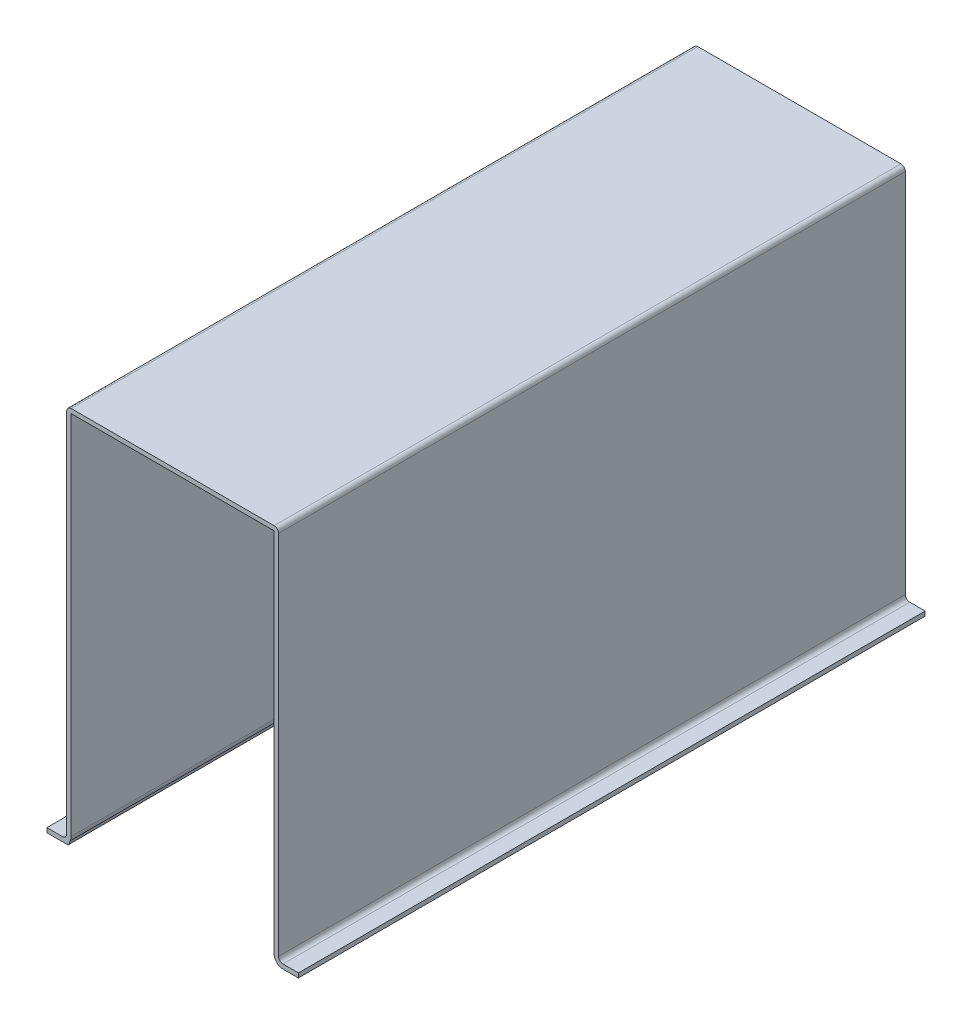
ISO-10303-21;
HEADER;
FILE_DESCRIPTION(('STEP AP214'),'2;1');
FILE_NAME('part.step','',(''),(''),'','','');
FILE_SCHEMA(('AUTOMOTIVE_DESIGN { 1 0 10303 214 1 1 1 1 }'));
ENDSEC;
DATA;
#1=APPLICATION_CONTEXT('core data for automotive mechanical design processes');
#2=APPLICATION_PROTOCOL_DEFINITION('international standard','automotive_design',2000,#1);
#3=PRODUCT_CONTEXT('',#1,'mechanical');
#4=PRODUCT('Part','Part','',(#3));
#5=PRODUCT_RELATED_PRODUCT_CATEGORY('part','',(#4));
#6=PRODUCT_DEFINITION_FORMATION('','',#4);
#7=PRODUCT_DEFINITION_CONTEXT('part definition',#1,'design');
#8=PRODUCT_DEFINITION('design','',#6,#7);
#9=PRODUCT_DEFINITION_SHAPE('','',#8);
#10=(LENGTH_UNIT() NAMED_UNIT(*) SI_UNIT(.MILLI.,.METRE.));
#11=(NAMED_UNIT(*) PLANE_ANGLE_UNIT() SI_UNIT($,.RADIAN.));
#12=(NAMED_UNIT(*) SI_UNIT($,.STERADIAN.) SOLID_ANGLE_UNIT());
#13=UNCERTAINTY_MEASURE_WITH_UNIT(LENGTH_MEASURE(1.E-05),#10,'distance_accuracy_value','');
#14=(GEOMETRIC_REPRESENTATION_CONTEXT(3) GLOBAL_UNCERTAINTY_ASSIGNED_CONTEXT((#13)) GLOBAL_UNIT_ASSIGNED_CONTEXT((#10,
#11,#12)) REPRESENTATION_CONTEXT('',''));
#15=CARTESIAN_POINT('',(0.,0.,0.));
#16=DIRECTION('',(0.,0.,1.));
#17=DIRECTION('',(1.,0.,0.));
#18=AXIS2_PLACEMENT_3D('',#15,#16,#17);
#19=CARTESIAN_POINT('',(-52.,-1.,284.));
#20=DIRECTION('',(0.,1.,0.));
#21=DIRECTION('',(0.,0.,1.));
#22=AXIS2_PLACEMENT_3D('',#19,#20,#21);
#23=PLANE('',#22);
#24=DIRECTION('',(1.,0.,0.));
#25=VECTOR('',#24,1.);
#26=CARTESIAN_POINT('',(-52.,-1.,284.));
#27=LINE('',#26,#25);
#28=CARTESIAN_POINT('',(49.5151548792866,-0.999999999999999,284.));
#29=VERTEX_POINT('',#28);
#30=CARTESIAN_POINT('',(57.,-1.,284.));
#31=VERTEX_POINT('',#30);
#32=EDGE_CURVE('E137',#29,#31,#27,.T.);
#33=ORIENTED_EDGE('',*,*,#32,.F.);
#34=DIRECTION('',(0.,0.,-1.));
#35=VECTOR('',#34,1.);
#36=CARTESIAN_POINT('',(49.5151548792866,-1.,284.));
#37=LINE('',#36,#35);
#38=CARTESIAN_POINT('',(49.5151548792866,-0.999999999999999,0.));
#39=VERTEX_POINT('',#38);
#40=EDGE_CURVE('E235',#29,#39,#37,.T.);
#41=ORIENTED_EDGE('',*,*,#40,.T.);
#42=DIRECTION('',(1.,0.,0.));
#43=VECTOR('',#42,1.);
#44=CARTESIAN_POINT('',(-52.,-1.,0.));
#45=LINE('',#44,#43);
#46=CARTESIAN_POINT('',(57.,-1.,0.));
#47=VERTEX_POINT('',#46);
#48=EDGE_CURVE('E159',#39,#47,#45,.T.);
#49=ORIENTED_EDGE('',*,*,#48,.T.);
#50=DIRECTION('',(0.,0.,-1.));
#51=VECTOR('',#50,1.);
#52=CARTESIAN_POINT('',(57.,-1.,284.));
#53=LINE('',#52,#51);
#54=EDGE_CURVE('E286',#31,#47,#53,.T.);
#55=ORIENTED_EDGE('',*,*,#54,.F.);
#56=EDGE_LOOP('',(#33,#41,#49,#55));
#57=FACE_BOUND('',#56,.T.);
#58=ADVANCED_FACE('F33',(#57),#23,.F.);
#59=CARTESIAN_POINT('',(-50.,3.,284.));
#60=DIRECTION('',(0.,0.,1.));
#61=DIRECTION('',(1.,0.,0.));
#62=AXIS2_PLACEMENT_3D('',#59,#60,#61);
#63=PLANE('',#62);
#64=CARTESIAN_POINT('',(50.0181378826154,2.96825000451866,284.));
#65=DIRECTION('',(0.,0.,1.));
#66=DIRECTION('',(-1.,0.,0.));
#67=AXIS2_PLACEMENT_3D('',#64,#65,#66);
#68=CIRCLE('',#67,4.);
#69=CARTESIAN_POINT('',(46.5358983848622,1.,284.));
#70=VERTEX_POINT('',#69);
#71=EDGE_CURVE('E258',#70,#29,#68,.T.);
#72=ORIENTED_EDGE('',*,*,#71,.T.);
#73=ORIENTED_EDGE('',*,*,#32,.T.);
#74=DIRECTION('',(0.,-1.,0.));
#75=VECTOR('',#74,1.);
#76=CARTESIAN_POINT('',(57.,1.,284.));
#77=LINE('',#76,#75);
#78=CARTESIAN_POINT('',(57.,1.,284.));
#79=VERTEX_POINT('',#78);
#80=EDGE_CURVE('E277',#79,#31,#77,.T.);
#81=ORIENTED_EDGE('',*,*,#80,.F.);
#82=DIRECTION('',(-1.,0.,0.));
#83=VECTOR('',#82,1.);
#84=CARTESIAN_POINT('',(50.,1.,284.));
#85=LINE('',#84,#83);
#86=CARTESIAN_POINT('',(50.,0.999999999999999,284.));
#87=VERTEX_POINT('',#86);
#88=EDGE_CURVE('E94',#79,#87,#85,.T.);
#89=ORIENTED_EDGE('',*,*,#88,.T.);
#90=CARTESIAN_POINT('',(50.,3.,284.));
#91=DIRECTION('',(0.,0.,-1.));
#92=DIRECTION('',(-1.,0.,0.));
#93=AXIS2_PLACEMENT_3D('',#90,#91,#92);
#94=CIRCLE('',#93,2.);
#95=CARTESIAN_POINT('',(48.,3.,284.));
#96=VERTEX_POINT('',#95);
#97=EDGE_CURVE('E198',#87,#96,#94,.T.);
#98=ORIENTED_EDGE('',*,*,#97,.T.);
#99=DIRECTION('',(0.,1.,0.));
#100=VECTOR('',#99,1.);
#101=CARTESIAN_POINT('',(48.,3.,284.));
#102=LINE('',#101,#100);
#103=CARTESIAN_POINT('',(48.,169.,284.));
#104=VERTEX_POINT('',#103);
#105=EDGE_CURVE('E178',#96,#104,#102,.T.);
#106=ORIENTED_EDGE('',*,*,#105,.T.);
#107=CARTESIAN_POINT('',(46.,169.,284.));
#108=DIRECTION('',(0.,0.,1.));
#109=DIRECTION('',(1.,0.,0.));
#110=AXIS2_PLACEMENT_3D('',#107,#108,#109);
#111=CIRCLE('',#110,2.);
#112=CARTESIAN_POINT('',(46.,171.,284.));
#113=VERTEX_POINT('',#112);
#114=EDGE_CURVE('E194',#104,#113,#111,.T.);
#115=ORIENTED_EDGE('',*,*,#114,.T.);
#116=DIRECTION('',(-1.,0.,0.));
#117=VECTOR('',#116,1.);
#118=CARTESIAN_POINT('',(-46.,171.,284.));
#119=LINE('',#118,#117);
#120=CARTESIAN_POINT('',(-46.,171.,284.));
#121=VERTEX_POINT('',#120);
#122=EDGE_CURVE('E118',#113,#121,#119,.T.);
#123=ORIENTED_EDGE('',*,*,#122,.T.);
#124=CARTESIAN_POINT('',(-46.,169.,284.));
#125=DIRECTION('',(0.,0.,1.));
#126=DIRECTION('',(-1.,0.,0.));
#127=AXIS2_PLACEMENT_3D('',#124,#125,#126);
#128=CIRCLE('',#127,2.);
#129=CARTESIAN_POINT('',(-48.,169.,284.));
#130=VERTEX_POINT('',#129);
#131=EDGE_CURVE('E111',#121,#130,#128,.T.);
#132=ORIENTED_EDGE('',*,*,#131,.T.);
#133=DIRECTION('',(0.,-1.,0.));
#134=VECTOR('',#133,1.);
#135=CARTESIAN_POINT('',(-48.,3.,284.));
#136=LINE('',#135,#134);
#137=CARTESIAN_POINT('',(-48.,3.,284.));
#138=VERTEX_POINT('',#137);
#139=EDGE_CURVE('E116',#130,#138,#136,.T.);
#140=ORIENTED_EDGE('',*,*,#139,.T.);
#141=CARTESIAN_POINT('',(-50.,3.,284.));
#142=DIRECTION('',(0.,0.,-1.));
#143=DIRECTION('',(1.,0.,0.));
#144=AXIS2_PLACEMENT_3D('',#141,#142,#143);
#145=CIRCLE('',#144,2.);
#146=CARTESIAN_POINT('',(-50.,1.,284.));
#147=VERTEX_POINT('',#146);
#148=EDGE_CURVE('E50',#138,#147,#145,.T.);
#149=ORIENTED_EDGE('',*,*,#148,.T.);
#150=DIRECTION('',(-1.,0.,0.));
#151=VECTOR('',#150,1.);
#152=CARTESIAN_POINT('',(-52.,1.,284.));
#153=LINE('',#152,#151);
#154=CARTESIAN_POINT('',(-57.,1.,284.));
#155=VERTEX_POINT('',#154);
#156=EDGE_CURVE('E132',#147,#155,#153,.T.);
#157=ORIENTED_EDGE('',*,*,#156,.T.);
#158=DIRECTION('',(0.,1.,0.));
#159=VECTOR('',#158,1.);
#160=CARTESIAN_POINT('',(-57.,-1.,284.));
#161=LINE('',#160,#159);
#162=CARTESIAN_POINT('',(-57.,-1.,284.));
#163=VERTEX_POINT('',#162);
#164=EDGE_CURVE('E262',#163,#155,#161,.T.);
#165=ORIENTED_EDGE('',*,*,#164,.F.);
#166=CARTESIAN_POINT('',(-47.4056226822031,-1.,284.));
#167=VERTEX_POINT('',#166);
#168=EDGE_CURVE('E138',#163,#167,#27,.T.);
#169=ORIENTED_EDGE('',*,*,#168,.T.);
#170=CARTESIAN_POINT('',(-50.4999951591916,1.53473055247611,284.));
#171=DIRECTION('',(0.,0.,1.));
#172=DIRECTION('',(-1.,0.,0.));
#173=AXIS2_PLACEMENT_3D('',#170,#171,#172);
#174=CIRCLE('',#173,4.);
#175=CARTESIAN_POINT('',(-46.5358983848623,1.,284.));
#176=VERTEX_POINT('',#175);
#177=EDGE_CURVE('E254',#167,#176,#174,.T.);
#178=ORIENTED_EDGE('',*,*,#177,.T.);
#179=CARTESIAN_POINT('',(-50.,3.,284.));
#180=DIRECTION('',(0.,0.,1.));
#181=DIRECTION('',(-1.,0.,0.));
#182=AXIS2_PLACEMENT_3D('',#179,#180,#181);
#183=CIRCLE('',#182,4.);
#184=CARTESIAN_POINT('',(-46.,3.,284.));
#185=VERTEX_POINT('',#184);
#186=EDGE_CURVE('E244',#176,#185,#183,.T.);
#187=ORIENTED_EDGE('',*,*,#186,.T.);
#188=DIRECTION('',(0.,1.,0.));
#189=VECTOR('',#188,1.);
#190=CARTESIAN_POINT('',(-46.,3.,284.));
#191=LINE('',#190,#189);
#192=CARTESIAN_POINT('',(-46.,169.,284.));
#193=VERTEX_POINT('',#192);
#194=EDGE_CURVE('E241',#185,#193,#191,.T.);
#195=ORIENTED_EDGE('',*,*,#194,.T.);
#196=DIRECTION('',(1.,0.,0.));
#197=VECTOR('',#196,1.);
#198=CARTESIAN_POINT('',(-46.,169.,284.));
#199=LINE('',#198,#197);
#200=CARTESIAN_POINT('',(46.,169.,284.));
#201=VERTEX_POINT('',#200);
#202=EDGE_CURVE('E238',#193,#201,#199,.T.);
#203=ORIENTED_EDGE('',*,*,#202,.T.);
#204=DIRECTION('',(0.,-1.,0.));
#205=VECTOR('',#204,1.);
#206=CARTESIAN_POINT('',(46.,169.,284.));
#207=LINE('',#206,#205);
#208=CARTESIAN_POINT('',(46.,3.,284.));
#209=VERTEX_POINT('',#208);
#210=EDGE_CURVE('E205',#201,#209,#207,.T.);
#211=ORIENTED_EDGE('',*,*,#210,.T.);
#212=CARTESIAN_POINT('',(50.,3.,284.));
#213=DIRECTION('',(0.,0.,1.));
#214=DIRECTION('',(-1.,0.,0.));
#215=AXIS2_PLACEMENT_3D('',#212,#213,#214);
#216=CIRCLE('',#215,4.);
#217=EDGE_CURVE('E222',#209,#70,#216,.T.);
#218=ORIENTED_EDGE('',*,*,#217,.T.);
#219=EDGE_LOOP('',(#72,#73,#81,#89,#98,#106,#115,#123,#132,#140,#149,#157,#165,#169,#178,#187,
#195,#203,#211,#218));
#220=FACE_BOUND('',#219,.T.);
#221=ADVANCED_FACE('F114',(#220),#63,.T.);
#222=CARTESIAN_POINT('',(-50.,3.,0.));
#223=DIRECTION('',(0.,0.,1.));
#224=DIRECTION('',(1.,0.,0.));
#225=AXIS2_PLACEMENT_3D('',#222,#223,#224);
#226=PLANE('',#225);
#227=ORIENTED_EDGE('',*,*,#48,.F.);
#228=CARTESIAN_POINT('',(50.0181378826154,2.96825000451866,0.));
#229=DIRECTION('',(0.,0.,1.));
#230=DIRECTION('',(-1.,0.,0.));
#231=AXIS2_PLACEMENT_3D('',#228,#229,#230);
#232=CIRCLE('',#231,4.);
#233=CARTESIAN_POINT('',(46.5358983848622,1.,0.));
#234=VERTEX_POINT('',#233);
#235=EDGE_CURVE('E259',#234,#39,#232,.T.);
#236=ORIENTED_EDGE('',*,*,#235,.F.);
#237=CARTESIAN_POINT('',(50.,3.,0.));
#238=DIRECTION('',(0.,0.,1.));
#239=DIRECTION('',(-1.,0.,0.));
#240=AXIS2_PLACEMENT_3D('',#237,#238,#239);
#241=CIRCLE('',#240,4.);
#242=CARTESIAN_POINT('',(46.,3.,0.));
#243=VERTEX_POINT('',#242);
#244=EDGE_CURVE('E232',#243,#234,#241,.T.);
#245=ORIENTED_EDGE('',*,*,#244,.F.);
#246=DIRECTION('',(0.,-1.,0.));
#247=VECTOR('',#246,1.);
#248=CARTESIAN_POINT('',(46.,169.,0.));
#249=LINE('',#248,#247);
#250=CARTESIAN_POINT('',(46.,169.,0.));
#251=VERTEX_POINT('',#250);
#252=EDGE_CURVE('E219',#251,#243,#249,.T.);
#253=ORIENTED_EDGE('',*,*,#252,.F.);
#254=DIRECTION('',(1.,0.,0.));
#255=VECTOR('',#254,1.);
#256=CARTESIAN_POINT('',(-46.,169.,0.));
#257=LINE('',#256,#255);
#258=CARTESIAN_POINT('',(-46.,169.,0.));
#259=VERTEX_POINT('',#258);
#260=EDGE_CURVE('E223',#259,#251,#257,.T.);
#261=ORIENTED_EDGE('',*,*,#260,.F.);
#262=DIRECTION('',(0.,1.,0.));
#263=VECTOR('',#262,1.);
#264=CARTESIAN_POINT('',(-46.,3.,0.));
#265=LINE('',#264,#263);
#266=CARTESIAN_POINT('',(-46.,3.,0.));
#267=VERTEX_POINT('',#266);
#268=EDGE_CURVE('E226',#267,#259,#265,.T.);
#269=ORIENTED_EDGE('',*,*,#268,.F.);
#270=CARTESIAN_POINT('',(-50.,3.,0.));
#271=DIRECTION('',(0.,0.,1.));
#272=DIRECTION('',(-1.,0.,0.));
#273=AXIS2_PLACEMENT_3D('',#270,#271,#272);
#274=CIRCLE('',#273,4.);
#275=CARTESIAN_POINT('',(-46.5358983848623,1.,0.));
#276=VERTEX_POINT('',#275);
#277=EDGE_CURVE('E229',#276,#267,#274,.T.);
#278=ORIENTED_EDGE('',*,*,#277,.F.);
#279=CARTESIAN_POINT('',(-50.4999951591916,1.53473055247611,0.));
#280=DIRECTION('',(0.,0.,1.));
#281=DIRECTION('',(-1.,0.,0.));
#282=AXIS2_PLACEMENT_3D('',#279,#280,#281);
#283=CIRCLE('',#282,4.);
#284=CARTESIAN_POINT('',(-47.4056226822031,-1.,0.));
#285=VERTEX_POINT('',#284);
#286=EDGE_CURVE('E255',#285,#276,#283,.T.);
#287=ORIENTED_EDGE('',*,*,#286,.F.);
#288=CARTESIAN_POINT('',(-57.,-1.,0.));
#289=VERTEX_POINT('',#288);
#290=EDGE_CURVE('E160',#289,#285,#45,.T.);
#291=ORIENTED_EDGE('',*,*,#290,.F.);
#292=DIRECTION('',(0.,-1.,0.));
#293=VECTOR('',#292,1.);
#294=CARTESIAN_POINT('',(-57.,1.,0.));
#295=LINE('',#294,#293);
#296=CARTESIAN_POINT('',(-57.,1.,0.));
#297=VERTEX_POINT('',#296);
#298=EDGE_CURVE('E271',#297,#289,#295,.T.);
#299=ORIENTED_EDGE('',*,*,#298,.F.);
#300=DIRECTION('',(-1.,0.,0.));
#301=VECTOR('',#300,1.);
#302=CARTESIAN_POINT('',(-52.,1.,0.));
#303=LINE('',#302,#301);
#304=CARTESIAN_POINT('',(-50.,1.,0.));
#305=VERTEX_POINT('',#304);
#306=EDGE_CURVE('E156',#305,#297,#303,.T.);
#307=ORIENTED_EDGE('',*,*,#306,.F.);
#308=CARTESIAN_POINT('',(-50.,3.,0.));
#309=DIRECTION('',(0.,0.,-1.));
#310=DIRECTION('',(1.,0.,0.));
#311=AXIS2_PLACEMENT_3D('',#308,#309,#310);
#312=CIRCLE('',#311,2.);
#313=CARTESIAN_POINT('',(-48.,3.,0.));
#314=VERTEX_POINT('',#313);
#315=EDGE_CURVE('E86',#314,#305,#312,.T.);
#316=ORIENTED_EDGE('',*,*,#315,.F.);
#317=DIRECTION('',(0.,-1.,0.));
#318=VECTOR('',#317,1.);
#319=CARTESIAN_POINT('',(-48.,3.,0.));
#320=LINE('',#319,#318);
#321=CARTESIAN_POINT('',(-48.,169.,0.));
#322=VERTEX_POINT('',#321);
#323=EDGE_CURVE('E80',#322,#314,#320,.T.);
#324=ORIENTED_EDGE('',*,*,#323,.F.);
#325=CARTESIAN_POINT('',(-46.,169.,0.));
#326=DIRECTION('',(0.,0.,1.));
#327=DIRECTION('',(-1.,0.,0.));
#328=AXIS2_PLACEMENT_3D('',#325,#326,#327);
#329=CIRCLE('',#328,2.);
#330=CARTESIAN_POINT('',(-46.,171.,0.));
#331=VERTEX_POINT('',#330);
#332=EDGE_CURVE('E126',#331,#322,#329,.T.);
#333=ORIENTED_EDGE('',*,*,#332,.F.);
#334=DIRECTION('',(-1.,0.,0.));
#335=VECTOR('',#334,1.);
#336=CARTESIAN_POINT('',(-46.,171.,0.));
#337=LINE('',#336,#335);
#338=CARTESIAN_POINT('',(46.,171.,0.));
#339=VERTEX_POINT('',#338);
#340=EDGE_CURVE('E151',#339,#331,#337,.T.);
#341=ORIENTED_EDGE('',*,*,#340,.F.);
#342=CARTESIAN_POINT('',(46.,169.,0.));
#343=DIRECTION('',(0.,0.,1.));
#344=DIRECTION('',(1.,0.,0.));
#345=AXIS2_PLACEMENT_3D('',#342,#343,#344);
#346=CIRCLE('',#345,2.);
#347=CARTESIAN_POINT('',(48.,169.,0.));
#348=VERTEX_POINT('',#347);
#349=EDGE_CURVE('E149',#348,#339,#346,.T.);
#350=ORIENTED_EDGE('',*,*,#349,.F.);
#351=DIRECTION('',(0.,1.,0.));
#352=VECTOR('',#351,1.);
#353=CARTESIAN_POINT('',(48.,3.,0.));
#354=LINE('',#353,#352);
#355=CARTESIAN_POINT('',(48.,3.,0.));
#356=VERTEX_POINT('',#355);
#357=EDGE_CURVE('E147',#356,#348,#354,.T.);
#358=ORIENTED_EDGE('',*,*,#357,.F.);
#359=CARTESIAN_POINT('',(50.,3.,0.));
#360=DIRECTION('',(0.,0.,-1.));
#361=DIRECTION('',(-1.,0.,0.));
#362=AXIS2_PLACEMENT_3D('',#359,#360,#361);
#363=CIRCLE('',#362,2.);
#364=CARTESIAN_POINT('',(50.,0.999999999999999,0.));
#365=VERTEX_POINT('',#364);
#366=EDGE_CURVE('E144',#365,#356,#363,.T.);
#367=ORIENTED_EDGE('',*,*,#366,.F.);
#368=DIRECTION('',(-1.,0.,0.));
#369=VECTOR('',#368,1.);
#370=CARTESIAN_POINT('',(50.,1.,0.));
#371=LINE('',#370,#369);
#372=CARTESIAN_POINT('',(57.,1.,0.));
#373=VERTEX_POINT('',#372);
#374=EDGE_CURVE('E142',#373,#365,#371,.T.);
#375=ORIENTED_EDGE('',*,*,#374,.F.);
#376=DIRECTION('',(0.,1.,0.));
#377=VECTOR('',#376,1.);
#378=CARTESIAN_POINT('',(57.,-1.,0.));
#379=LINE('',#378,#377);
#380=EDGE_CURVE('E283',#47,#373,#379,.T.);
#381=ORIENTED_EDGE('',*,*,#380,.F.);
#382=EDGE_LOOP('',(#227,#236,#245,#253,#261,#269,#278,#287,#291,#299,#307,#316,#324,#333,#341,
#350,#358,#367,#375,#381));
#383=FACE_BOUND('',#382,.T.);
#384=ADVANCED_FACE('F185',(#383),#226,.F.);
#385=CARTESIAN_POINT('',(50.,1.,284.));
#386=DIRECTION('',(0.,-1.,0.));
#387=DIRECTION('',(1.,0.,0.));
#388=AXIS2_PLACEMENT_3D('',#385,#386,#387);
#389=PLANE('',#388);
#390=ORIENTED_EDGE('',*,*,#374,.T.);
#391=DIRECTION('',(0.,0.,-1.));
#392=VECTOR('',#391,1.);
#393=CARTESIAN_POINT('',(50.,0.999999999999999,284.));
#394=LINE('',#393,#392);
#395=EDGE_CURVE('E11',#87,#365,#394,.T.);
#396=ORIENTED_EDGE('',*,*,#395,.F.);
#397=ORIENTED_EDGE('',*,*,#88,.F.);
#398=DIRECTION('',(0.,0.,1.));
#399=VECTOR('',#398,1.);
#400=CARTESIAN_POINT('',(57.,1.,0.));
#401=LINE('',#400,#399);
#402=EDGE_CURVE('E280',#373,#79,#401,.T.);
#403=ORIENTED_EDGE('',*,*,#402,.F.);
#404=EDGE_LOOP('',(#390,#396,#397,#403));
#405=FACE_BOUND('',#404,.T.);
#406=ADVANCED_FACE('F35',(#405),#389,.F.);
#407=CARTESIAN_POINT('',(50.,3.,284.));
#408=DIRECTION('',(0.,0.,-1.));
#409=DIRECTION('',(-1.,0.,0.));
#410=AXIS2_PLACEMENT_3D('',#407,#408,#409);
#411=CYLINDRICAL_SURFACE('',#410,2.);
#412=ORIENTED_EDGE('',*,*,#366,.T.);
#413=DIRECTION('',(0.,0.,-1.));
#414=VECTOR('',#413,1.);
#415=CARTESIAN_POINT('',(48.,3.,284.));
#416=LINE('',#415,#414);
#417=EDGE_CURVE('E42',#96,#356,#416,.T.);
#418=ORIENTED_EDGE('',*,*,#417,.F.);
#419=ORIENTED_EDGE('',*,*,#97,.F.);
#420=ORIENTED_EDGE('',*,*,#395,.T.);
#421=EDGE_LOOP('',(#412,#418,#419,#420));
#422=FACE_BOUND('',#421,.T.);
#423=ADVANCED_FACE('F422',(#422),#411,.F.);
#424=CARTESIAN_POINT('',(48.,3.,284.));
#425=DIRECTION('',(-1.,0.,0.));
#426=DIRECTION('',(0.,-1.,0.));
#427=AXIS2_PLACEMENT_3D('',#424,#425,#426);
#428=PLANE('',#427);
#429=ORIENTED_EDGE('',*,*,#357,.T.);
#430=DIRECTION('',(0.,0.,-1.));
#431=VECTOR('',#430,1.);
#432=CARTESIAN_POINT('',(48.,169.,284.));
#433=LINE('',#432,#431);
#434=EDGE_CURVE('E169',#104,#348,#433,.T.);
#435=ORIENTED_EDGE('',*,*,#434,.F.);
#436=ORIENTED_EDGE('',*,*,#105,.F.);
#437=ORIENTED_EDGE('',*,*,#417,.T.);
#438=EDGE_LOOP('',(#429,#435,#436,#437));
#439=FACE_BOUND('',#438,.T.);
#440=ADVANCED_FACE('F176',(#439),#428,.F.);
#441=CARTESIAN_POINT('',(46.,169.,284.));
#442=DIRECTION('',(0.,0.,-1.));
#443=DIRECTION('',(-1.,0.,0.));
#444=AXIS2_PLACEMENT_3D('',#441,#442,#443);
#445=CYLINDRICAL_SURFACE('',#444,2.);
#446=ORIENTED_EDGE('',*,*,#349,.T.);
#447=DIRECTION('',(0.,0.,-1.));
#448=VECTOR('',#447,1.);
#449=CARTESIAN_POINT('',(46.,171.,284.));
#450=LINE('',#449,#448);
#451=EDGE_CURVE('E166',#113,#339,#450,.T.);
#452=ORIENTED_EDGE('',*,*,#451,.F.);
#453=ORIENTED_EDGE('',*,*,#114,.F.);
#454=ORIENTED_EDGE('',*,*,#434,.T.);
#455=EDGE_LOOP('',(#446,#452,#453,#454));
#456=FACE_BOUND('',#455,.T.);
#457=ADVANCED_FACE('F190',(#456),#445,.T.);
#458=CARTESIAN_POINT('',(-46.,171.,284.));
#459=DIRECTION('',(0.,-1.,0.));
#460=DIRECTION('',(0.,0.,-1.));
#461=AXIS2_PLACEMENT_3D('',#458,#459,#460);
#462=PLANE('',#461);
#463=ORIENTED_EDGE('',*,*,#340,.T.);
#464=DIRECTION('',(0.,0.,-1.));
#465=VECTOR('',#464,1.);
#466=CARTESIAN_POINT('',(-46.,171.,284.));
#467=LINE('',#466,#465);
#468=EDGE_CURVE('E127',#121,#331,#467,.T.);
#469=ORIENTED_EDGE('',*,*,#468,.F.);
#470=ORIENTED_EDGE('',*,*,#122,.F.);
#471=ORIENTED_EDGE('',*,*,#451,.T.);
#472=EDGE_LOOP('',(#463,#469,#470,#471));
#473=FACE_BOUND('',#472,.T.);
#474=ADVANCED_FACE('F193',(#473),#462,.F.);
#475=CARTESIAN_POINT('',(-46.,169.,284.));
#476=DIRECTION('',(0.,0.,-1.));
#477=DIRECTION('',(-1.,0.,0.));
#478=AXIS2_PLACEMENT_3D('',#475,#476,#477);
#479=CYLINDRICAL_SURFACE('',#478,2.);
#480=ORIENTED_EDGE('',*,*,#332,.T.);
#481=DIRECTION('',(0.,0.,-1.));
#482=VECTOR('',#481,1.);
#483=CARTESIAN_POINT('',(-48.,169.,284.));
#484=LINE('',#483,#482);
#485=EDGE_CURVE('E123',#130,#322,#484,.T.);
#486=ORIENTED_EDGE('',*,*,#485,.F.);
#487=ORIENTED_EDGE('',*,*,#131,.F.);
#488=ORIENTED_EDGE('',*,*,#468,.T.);
#489=EDGE_LOOP('',(#480,#486,#487,#488));
#490=FACE_BOUND('',#489,.T.);
#491=ADVANCED_FACE('F124',(#490),#479,.T.);
#492=CARTESIAN_POINT('',(-48.,3.,284.));
#493=DIRECTION('',(1.,0.,0.));
#494=DIRECTION('',(0.,1.,0.));
#495=AXIS2_PLACEMENT_3D('',#492,#493,#494);
#496=PLANE('',#495);
#497=ORIENTED_EDGE('',*,*,#323,.T.);
#498=DIRECTION('',(0.,0.,-1.));
#499=VECTOR('',#498,1.);
#500=CARTESIAN_POINT('',(-48.,3.,284.));
#501=LINE('',#500,#499);
#502=EDGE_CURVE('E128',#138,#314,#501,.T.);
#503=ORIENTED_EDGE('',*,*,#502,.F.);
#504=ORIENTED_EDGE('',*,*,#139,.F.);
#505=ORIENTED_EDGE('',*,*,#485,.T.);
#506=EDGE_LOOP('',(#497,#503,#504,#505));
#507=FACE_BOUND('',#506,.T.);
#508=ADVANCED_FACE('F130',(#507),#496,.F.);
#509=CARTESIAN_POINT('',(-50.,3.,284.));
#510=DIRECTION('',(0.,0.,-1.));
#511=DIRECTION('',(-1.,0.,0.));
#512=AXIS2_PLACEMENT_3D('',#509,#510,#511);
#513=CYLINDRICAL_SURFACE('',#512,2.);
#514=ORIENTED_EDGE('',*,*,#315,.T.);
#515=DIRECTION('',(0.,0.,-1.));
#516=VECTOR('',#515,1.);
#517=CARTESIAN_POINT('',(-50.,1.,284.));
#518=LINE('',#517,#516);
#519=EDGE_CURVE('E141',#147,#305,#518,.T.);
#520=ORIENTED_EDGE('',*,*,#519,.F.);
#521=ORIENTED_EDGE('',*,*,#148,.F.);
#522=ORIENTED_EDGE('',*,*,#502,.T.);
#523=EDGE_LOOP('',(#514,#520,#521,#522));
#524=FACE_BOUND('',#523,.T.);
#525=ADVANCED_FACE('F391',(#524),#513,.F.);
#526=CARTESIAN_POINT('',(-52.,1.,284.));
#527=DIRECTION('',(0.,-1.,0.));
#528=DIRECTION('',(0.,0.,-1.));
#529=AXIS2_PLACEMENT_3D('',#526,#527,#528);
#530=PLANE('',#529);
#531=ORIENTED_EDGE('',*,*,#306,.T.);
#532=DIRECTION('',(0.,0.,-1.));
#533=VECTOR('',#532,1.);
#534=CARTESIAN_POINT('',(-57.,1.,284.));
#535=LINE('',#534,#533);
#536=EDGE_CURVE('E274',#155,#297,#535,.T.);
#537=ORIENTED_EDGE('',*,*,#536,.F.);
#538=ORIENTED_EDGE('',*,*,#156,.F.);
#539=ORIENTED_EDGE('',*,*,#519,.T.);
#540=EDGE_LOOP('',(#531,#537,#538,#539));
#541=FACE_BOUND('',#540,.T.);
#542=ADVANCED_FACE('F389',(#541),#530,.F.);
#543=ORIENTED_EDGE('',*,*,#290,.T.);
#544=DIRECTION('',(0.,0.,-1.));
#545=VECTOR('',#544,1.);
#546=CARTESIAN_POINT('',(-47.4056226822031,-1.,284.));
#547=LINE('',#546,#545);
#548=EDGE_CURVE('E251',#285,#167,#547,.F.);
#549=ORIENTED_EDGE('',*,*,#548,.T.);
#550=ORIENTED_EDGE('',*,*,#168,.F.);
#551=DIRECTION('',(0.,0.,1.));
#552=VECTOR('',#551,1.);
#553=CARTESIAN_POINT('',(-57.,-1.,0.));
#554=LINE('',#553,#552);
#555=EDGE_CURVE('E268',#289,#163,#554,.T.);
#556=ORIENTED_EDGE('',*,*,#555,.F.);
#557=EDGE_LOOP('',(#543,#549,#550,#556));
#558=FACE_BOUND('',#557,.T.);
#559=ADVANCED_FACE('F382',(#558),#23,.F.);
#560=CARTESIAN_POINT('',(50.,3.,284.));
#561=DIRECTION('',(0.,0.,-1.));
#562=DIRECTION('',(-1.,0.,0.));
#563=AXIS2_PLACEMENT_3D('',#560,#561,#562);
#564=CYLINDRICAL_SURFACE('',#563,4.);
#565=ORIENTED_EDGE('',*,*,#244,.T.);
#566=DIRECTION('',(0.,0.,-1.));
#567=VECTOR('',#566,1.);
#568=CARTESIAN_POINT('',(46.5358983848622,1.,284.));
#569=LINE('',#568,#567);
#570=EDGE_CURVE('E201',#70,#234,#569,.T.);
#571=ORIENTED_EDGE('',*,*,#570,.F.);
#572=ORIENTED_EDGE('',*,*,#217,.F.);
#573=DIRECTION('',(0.,0.,-1.));
#574=VECTOR('',#573,1.);
#575=CARTESIAN_POINT('',(46.,3.,284.));
#576=LINE('',#575,#574);
#577=EDGE_CURVE('E145',#209,#243,#576,.T.);
#578=ORIENTED_EDGE('',*,*,#577,.T.);
#579=EDGE_LOOP('',(#565,#571,#572,#578));
#580=FACE_BOUND('',#579,.T.);
#581=ADVANCED_FACE('F356',(#580),#564,.T.);
#582=CARTESIAN_POINT('',(46.,169.,284.));
#583=DIRECTION('',(1.,0.,0.));
#584=DIRECTION('',(0.,0.,-1.));
#585=AXIS2_PLACEMENT_3D('',#582,#583,#584);
#586=PLANE('',#585);
#587=ORIENTED_EDGE('',*,*,#252,.T.);
#588=ORIENTED_EDGE('',*,*,#577,.F.);
#589=ORIENTED_EDGE('',*,*,#210,.F.);
#590=DIRECTION('',(0.,0.,-1.));
#591=VECTOR('',#590,1.);
#592=CARTESIAN_POINT('',(46.,169.,284.));
#593=LINE('',#592,#591);
#594=EDGE_CURVE('E214',#201,#251,#593,.T.);
#595=ORIENTED_EDGE('',*,*,#594,.T.);
#596=EDGE_LOOP('',(#587,#588,#589,#595));
#597=FACE_BOUND('',#596,.T.);
#598=ADVANCED_FACE('F360',(#597),#586,.F.);
#599=CARTESIAN_POINT('',(-46.,169.,284.));
#600=DIRECTION('',(0.,1.,0.));
#601=DIRECTION('',(0.,0.,1.));
#602=AXIS2_PLACEMENT_3D('',#599,#600,#601);
#603=PLANE('',#602);
#604=ORIENTED_EDGE('',*,*,#260,.T.);
#605=ORIENTED_EDGE('',*,*,#594,.F.);
#606=ORIENTED_EDGE('',*,*,#202,.F.);
#607=DIRECTION('',(0.,0.,-1.));
#608=VECTOR('',#607,1.);
#609=CARTESIAN_POINT('',(-46.,169.,284.));
#610=LINE('',#609,#608);
#611=EDGE_CURVE('E211',#193,#259,#610,.T.);
#612=ORIENTED_EDGE('',*,*,#611,.T.);
#613=EDGE_LOOP('',(#604,#605,#606,#612));
#614=FACE_BOUND('',#613,.T.);
#615=ADVANCED_FACE('F368',(#614),#603,.F.);
#616=CARTESIAN_POINT('',(-46.,3.,284.));
#617=DIRECTION('',(-1.,0.,0.));
#618=DIRECTION('',(0.,-1.,0.));
#619=AXIS2_PLACEMENT_3D('',#616,#617,#618);
#620=PLANE('',#619);
#621=ORIENTED_EDGE('',*,*,#268,.T.);
#622=ORIENTED_EDGE('',*,*,#611,.F.);
#623=ORIENTED_EDGE('',*,*,#194,.F.);
#624=DIRECTION('',(0.,0.,-1.));
#625=VECTOR('',#624,1.);
#626=CARTESIAN_POINT('',(-46.,3.,284.));
#627=LINE('',#626,#625);
#628=EDGE_CURVE('E208',#185,#267,#627,.T.);
#629=ORIENTED_EDGE('',*,*,#628,.T.);
#630=EDGE_LOOP('',(#621,#622,#623,#629));
#631=FACE_BOUND('',#630,.T.);
#632=ADVANCED_FACE('F373',(#631),#620,.F.);
#633=CARTESIAN_POINT('',(-50.,3.,284.));
#634=DIRECTION('',(0.,0.,-1.));
#635=DIRECTION('',(-1.,0.,0.));
#636=AXIS2_PLACEMENT_3D('',#633,#634,#635);
#637=CYLINDRICAL_SURFACE('',#636,4.);
#638=ORIENTED_EDGE('',*,*,#277,.T.);
#639=ORIENTED_EDGE('',*,*,#628,.F.);
#640=ORIENTED_EDGE('',*,*,#186,.F.);
#641=DIRECTION('',(0.,0.,-1.));
#642=VECTOR('',#641,1.);
#643=CARTESIAN_POINT('',(-46.5358983848623,1.,284.));
#644=LINE('',#643,#642);
#645=EDGE_CURVE('E204',#176,#276,#644,.T.);
#646=ORIENTED_EDGE('',*,*,#645,.T.);
#647=EDGE_LOOP('',(#638,#639,#640,#646));
#648=FACE_BOUND('',#647,.T.);
#649=ADVANCED_FACE('F376',(#648),#637,.T.);
#650=CARTESIAN_POINT('',(-50.4999951591916,1.53473055247611,284.));
#651=DIRECTION('',(0.,0.,-1.));
#652=DIRECTION('',(-1.,0.,0.));
#653=AXIS2_PLACEMENT_3D('',#650,#651,#652);
#654=CYLINDRICAL_SURFACE('',#653,4.);
#655=ORIENTED_EDGE('',*,*,#286,.T.);
#656=ORIENTED_EDGE('',*,*,#645,.F.);
#657=ORIENTED_EDGE('',*,*,#177,.F.);
#658=ORIENTED_EDGE('',*,*,#548,.F.);
#659=EDGE_LOOP('',(#655,#656,#657,#658));
#660=FACE_BOUND('',#659,.T.);
#661=ADVANCED_FACE('F378',(#660),#654,.T.);
#662=CARTESIAN_POINT('',(50.0181378826154,2.96825000451866,284.));
#663=DIRECTION('',(0.,0.,-1.));
#664=DIRECTION('',(-1.,0.,0.));
#665=AXIS2_PLACEMENT_3D('',#662,#663,#664);
#666=CYLINDRICAL_SURFACE('',#665,4.);
#667=ORIENTED_EDGE('',*,*,#71,.F.);
#668=ORIENTED_EDGE('',*,*,#570,.T.);
#669=ORIENTED_EDGE('',*,*,#235,.T.);
#670=ORIENTED_EDGE('',*,*,#40,.F.);
#671=EDGE_LOOP('',(#667,#668,#669,#670));
#672=FACE_BOUND('',#671,.T.);
#673=ADVANCED_FACE('F364',(#672),#666,.T.);
#674=CARTESIAN_POINT('',(-57.,0.,0.));
#675=DIRECTION('',(-1.,0.,0.));
#676=DIRECTION('',(0.,0.,1.));
#677=AXIS2_PLACEMENT_3D('',#674,#675,#676);
#678=PLANE('',#677);
#679=ORIENTED_EDGE('',*,*,#536,.T.);
#680=ORIENTED_EDGE('',*,*,#298,.T.);
#681=ORIENTED_EDGE('',*,*,#555,.T.);
#682=ORIENTED_EDGE('',*,*,#164,.T.);
#683=EDGE_LOOP('',(#679,#680,#681,#682));
#684=FACE_BOUND('',#683,.T.);
#685=ADVANCED_FACE('F384',(#684),#678,.T.);
#686=CARTESIAN_POINT('',(57.,0.,0.));
#687=DIRECTION('',(1.,0.,0.));
#688=DIRECTION('',(0.,0.,-1.));
#689=AXIS2_PLACEMENT_3D('',#686,#687,#688);
#690=PLANE('',#689);
#691=ORIENTED_EDGE('',*,*,#54,.T.);
#692=ORIENTED_EDGE('',*,*,#380,.T.);
#693=ORIENTED_EDGE('',*,*,#402,.T.);
#694=ORIENTED_EDGE('',*,*,#80,.T.);
#695=EDGE_LOOP('',(#691,#692,#693,#694));
#696=FACE_BOUND('',#695,.T.);
#697=ADVANCED_FACE('F291',(#696),#690,.T.);
#698=CLOSED_SHELL('',(#58,#221,#384,#406,#423,#440,#457,#474,#491,#508,#525,#542,#559,#581,#598,
#615,#632,#649,#661,#673,#685,#697));
#699=MANIFOLD_SOLID_BREP('B2',#698);
#700=ADVANCED_BREP_SHAPE_REPRESENTATION('',(#18,#699),#14);
#701=SHAPE_DEFINITION_REPRESENTATION(#9,#700);
ENDSEC;
END-ISO-10303-21;
